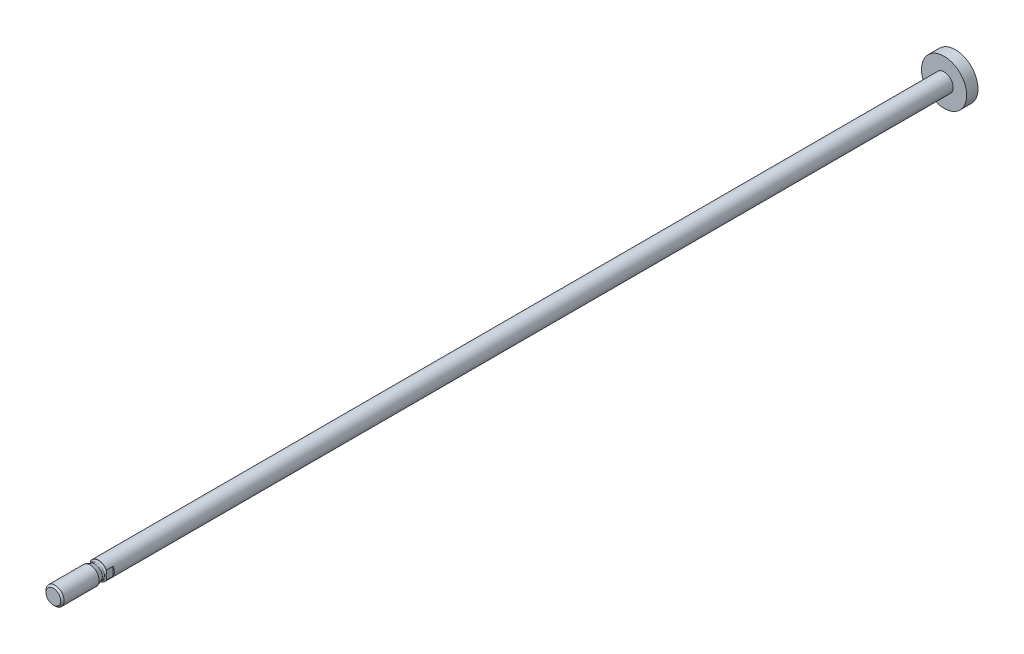
ISO-10303-21;
HEADER;
FILE_DESCRIPTION(('STEP AP214'),'2;1');
FILE_NAME('part.step','',(''),(''),'','','');
FILE_SCHEMA(('AUTOMOTIVE_DESIGN { 1 0 10303 214 1 1 1 1 }'));
ENDSEC;
DATA;
#1=APPLICATION_CONTEXT('core data for automotive mechanical design processes');
#2=APPLICATION_PROTOCOL_DEFINITION('international standard','automotive_design',2000,#1);
#3=PRODUCT_CONTEXT('',#1,'mechanical');
#4=PRODUCT('Part','Part','',(#3));
#5=PRODUCT_RELATED_PRODUCT_CATEGORY('part','',(#4));
#6=PRODUCT_DEFINITION_FORMATION('','',#4);
#7=PRODUCT_DEFINITION_CONTEXT('part definition',#1,'design');
#8=PRODUCT_DEFINITION('design','',#6,#7);
#9=PRODUCT_DEFINITION_SHAPE('','',#8);
#10=(LENGTH_UNIT() NAMED_UNIT(*) SI_UNIT(.MILLI.,.METRE.));
#11=(NAMED_UNIT(*) PLANE_ANGLE_UNIT() SI_UNIT($,.RADIAN.));
#12=(NAMED_UNIT(*) SI_UNIT($,.STERADIAN.) SOLID_ANGLE_UNIT());
#13=UNCERTAINTY_MEASURE_WITH_UNIT(LENGTH_MEASURE(1.E-05),#10,'distance_accuracy_value','');
#14=(GEOMETRIC_REPRESENTATION_CONTEXT(3) GLOBAL_UNCERTAINTY_ASSIGNED_CONTEXT((#13)) GLOBAL_UNIT_ASSIGNED_CONTEXT((#10,
#11,#12)) REPRESENTATION_CONTEXT('',''));
#15=CARTESIAN_POINT('',(0.,0.,0.));
#16=DIRECTION('',(0.,0.,1.));
#17=DIRECTION('',(1.,0.,0.));
#18=AXIS2_PLACEMENT_3D('',#15,#16,#17);
#19=CARTESIAN_POINT('',(0.,0.,4.));
#20=DIRECTION('',(0.,0.,-1.));
#21=DIRECTION('',(-1.,0.,0.));
#22=AXIS2_PLACEMENT_3D('',#19,#20,#21);
#23=PLANE('',#22);
#24=DIRECTION('',(0.,1.,0.));
#25=VECTOR('',#24,1.);
#26=CARTESIAN_POINT('',(-3.5,0.,4.));
#27=LINE('',#26,#25);
#28=CARTESIAN_POINT('',(-3.5,-1.93649167310371,4.));
#29=VERTEX_POINT('',#28);
#30=CARTESIAN_POINT('',(-3.5,-1.47986485869513,4.));
#31=VERTEX_POINT('',#30);
#32=EDGE_CURVE('E55',#29,#31,#27,.T.);
#33=ORIENTED_EDGE('',*,*,#32,.F.);
#34=CARTESIAN_POINT('',(0.,0.,4.));
#35=DIRECTION('',(0.,0.,1.));
#36=DIRECTION('',(1.,0.,0.));
#37=AXIS2_PLACEMENT_3D('',#34,#35,#36);
#38=CIRCLE('',#37,4.);
#39=CARTESIAN_POINT('',(3.5,-1.93649167310371,4.));
#40=VERTEX_POINT('',#39);
#41=EDGE_CURVE('E148',#29,#40,#38,.T.);
#42=ORIENTED_EDGE('',*,*,#41,.T.);
#43=DIRECTION('',(0.,-1.,0.));
#44=VECTOR('',#43,1.);
#45=CARTESIAN_POINT('',(3.5,0.,4.));
#46=LINE('',#45,#44);
#47=CARTESIAN_POINT('',(3.5,-1.47986485869513,3.99999999999992));
#48=VERTEX_POINT('',#47);
#49=EDGE_CURVE('E102',#48,#40,#46,.T.);
#50=ORIENTED_EDGE('',*,*,#49,.F.);
#51=CARTESIAN_POINT('',(0.,0.,4.));
#52=DIRECTION('',(0.,0.,1.));
#53=DIRECTION('',(1.,0.,0.));
#54=AXIS2_PLACEMENT_3D('',#51,#52,#53);
#55=CIRCLE('',#54,3.8000000000001);
#56=EDGE_CURVE('E150',#31,#48,#55,.T.);
#57=ORIENTED_EDGE('',*,*,#56,.F.);
#58=EDGE_LOOP('',(#33,#42,#50,#57));
#59=FACE_BOUND('',#58,.T.);
#60=ADVANCED_FACE('F41',(#59),#23,.F.);
#61=CARTESIAN_POINT('',(-3.5,1.47986485869513,3.99999999999992));
#62=VERTEX_POINT('',#61);
#63=CARTESIAN_POINT('',(-3.5,1.93649167310371,4.));
#64=VERTEX_POINT('',#63);
#65=EDGE_CURVE('E111',#62,#64,#27,.T.);
#66=ORIENTED_EDGE('',*,*,#65,.F.);
#67=CARTESIAN_POINT('',(3.5,1.47986485869513,4.));
#68=VERTEX_POINT('',#67);
#69=EDGE_CURVE('E151',#68,#62,#55,.T.);
#70=ORIENTED_EDGE('',*,*,#69,.F.);
#71=CARTESIAN_POINT('',(3.5,1.93649167310371,4.));
#72=VERTEX_POINT('',#71);
#73=EDGE_CURVE('E63',#72,#68,#46,.T.);
#74=ORIENTED_EDGE('',*,*,#73,.F.);
#75=EDGE_CURVE('E110',#72,#64,#38,.T.);
#76=ORIENTED_EDGE('',*,*,#75,.T.);
#77=EDGE_LOOP('',(#66,#70,#74,#76));
#78=FACE_BOUND('',#77,.T.);
#79=ADVANCED_FACE('F207',(#78),#23,.F.);
#80=CARTESIAN_POINT('',(0.,0.,-375.3));
#81=DIRECTION('',(0.,0.,1.));
#82=DIRECTION('',(1.,0.,0.));
#83=AXIS2_PLACEMENT_3D('',#80,#81,#82);
#84=CYLINDRICAL_SURFACE('',#83,4.);
#85=CARTESIAN_POINT('',(0.,0.,-370.3));
#86=DIRECTION('',(0.,0.,1.));
#87=DIRECTION('',(1.,0.,0.));
#88=AXIS2_PLACEMENT_3D('',#85,#86,#87);
#89=CIRCLE('',#88,4.);
#90=CARTESIAN_POINT('',(4.,0.,-370.3));
#91=VERTEX_POINT('',#90);
#92=EDGE_CURVE('E145',#91,#91,#89,.T.);
#93=ORIENTED_EDGE('',*,*,#92,.T.);
#94=EDGE_LOOP('',(#93));
#95=FACE_BOUND('',#94,.T.);
#96=DIRECTION('',(0.,0.,1.));
#97=VECTOR('',#96,1.);
#98=CARTESIAN_POINT('',(-3.5,-1.93649167310371,-375.3));
#99=LINE('',#98,#97);
#100=CARTESIAN_POINT('',(-3.5,-1.93649167310371,1.));
#101=VERTEX_POINT('',#100);
#102=EDGE_CURVE('E119',#101,#29,#99,.T.);
#103=ORIENTED_EDGE('',*,*,#102,.F.);
#104=CARTESIAN_POINT('',(0.,0.,1.));
#105=DIRECTION('',(0.,0.,1.));
#106=DIRECTION('',(1.,0.,0.));
#107=AXIS2_PLACEMENT_3D('',#104,#105,#106);
#108=CIRCLE('',#107,4.);
#109=CARTESIAN_POINT('',(-3.5,1.93649167310371,1.));
#110=VERTEX_POINT('',#109);
#111=EDGE_CURVE('E11',#110,#101,#108,.T.);
#112=ORIENTED_EDGE('',*,*,#111,.F.);
#113=DIRECTION('',(0.,0.,1.));
#114=VECTOR('',#113,1.);
#115=CARTESIAN_POINT('',(-3.5,1.93649167310371,-375.3));
#116=LINE('',#115,#114);
#117=EDGE_CURVE('E117',#64,#110,#116,.F.);
#118=ORIENTED_EDGE('',*,*,#117,.F.);
#119=ORIENTED_EDGE('',*,*,#75,.F.);
#120=DIRECTION('',(0.,0.,1.));
#121=VECTOR('',#120,1.);
#122=CARTESIAN_POINT('',(3.5,1.93649167310371,-375.3));
#123=LINE('',#122,#121);
#124=CARTESIAN_POINT('',(3.5,1.93649167310371,1.));
#125=VERTEX_POINT('',#124);
#126=EDGE_CURVE('E100',#125,#72,#123,.T.);
#127=ORIENTED_EDGE('',*,*,#126,.F.);
#128=CARTESIAN_POINT('',(3.5,-1.93649167310371,1.));
#129=VERTEX_POINT('',#128);
#130=EDGE_CURVE('E44',#129,#125,#108,.T.);
#131=ORIENTED_EDGE('',*,*,#130,.F.);
#132=DIRECTION('',(0.,0.,1.));
#133=VECTOR('',#132,1.);
#134=CARTESIAN_POINT('',(3.5,-1.93649167310371,-375.3));
#135=LINE('',#134,#133);
#136=EDGE_CURVE('E101',#40,#129,#135,.F.);
#137=ORIENTED_EDGE('',*,*,#136,.F.);
#138=ORIENTED_EDGE('',*,*,#41,.F.);
#139=EDGE_LOOP('',(#103,#112,#118,#119,#127,#131,#137,#138));
#140=FACE_BOUND('',#139,.T.);
#141=ADVANCED_FACE('F107',(#95,#140),#84,.T.);
#142=CARTESIAN_POINT('',(0.,0.,4.6000000000001));
#143=DIRECTION('',(0.,0.,1.));
#144=DIRECTION('',(1.,0.,0.));
#145=AXIS2_PLACEMENT_3D('',#142,#143,#144);
#146=TOROIDAL_SURFACE('',#145,3.8000000000001,0.600000000000099);
#147=CARTESIAN_POINT('',(0.,0.,4.6));
#148=DIRECTION('',(0.,0.,1.));
#149=DIRECTION('',(1.,0.,0.));
#150=AXIS2_PLACEMENT_3D('',#147,#148,#149);
#151=CIRCLE('',#150,3.2);
#152=CARTESIAN_POINT('',(3.2,0.,4.6));
#153=VERTEX_POINT('',#152);
#154=EDGE_CURVE('E136',#153,#153,#151,.T.);
#155=ORIENTED_EDGE('',*,*,#154,.F.);
#156=EDGE_LOOP('',(#155));
#157=FACE_BOUND('',#156,.T.);
#158=CARTESIAN_POINT('',(-3.5,0.,4.08038475772938));
#159=CARTESIAN_POINT('',(-3.5,0.0500062055653644,4.08038579524003));
#160=CARTESIAN_POINT('',(-3.5,0.10001186907905,4.07976142660828));
#161=CARTESIAN_POINT('',(-3.5,0.200008073579427,4.07732415974821));
#162=CARTESIAN_POINT('',(-3.5,0.249998606009498,4.07551091782565));
#163=CARTESIAN_POINT('',(-3.5,0.350023676666661,4.0708553451476));
#164=CARTESIAN_POINT('',(-3.5,0.400058122823757,4.06801109956585));
#165=CARTESIAN_POINT('',(-3.5,0.500067954430721,4.06154909714063));
#166=CARTESIAN_POINT('',(-3.5,0.550043347826766,4.05793146015032));
#167=CARTESIAN_POINT('',(-3.5,0.690839508563253,4.04708094798961));
#168=CARTESIAN_POINT('',(-3.5,0.781617050076563,4.03931230060361));
#169=CARTESIAN_POINT('',(-3.5,0.9632220149238,4.024401341373));
#170=CARTESIAN_POINT('',(-3.5,1.05404943604569,4.01725900370584));
#171=CARTESIAN_POINT('',(-3.5,1.2359337458161,4.00596554667804));
#172=CARTESIAN_POINT('',(-3.5,1.32699066193964,4.00181480438343));
#173=CARTESIAN_POINT('',(-3.5,1.50913050906379,3.99911696420226));
#174=CARTESIAN_POINT('',(-3.5,1.60021331380939,4.00056402453771));
#175=CARTESIAN_POINT('',(-3.5,1.7832512039485,4.01223826838346));
#176=CARTESIAN_POINT('',(-3.5,1.87520111900955,4.02258560378902));
#177=CARTESIAN_POINT('',(-3.5,2.01109807868235,4.04805353771768));
#178=CARTESIAN_POINT('',(-3.5,2.05597275422268,4.05817105079477));
#179=CARTESIAN_POINT('',(-3.5,2.1446015872334,4.08243134215497));
#180=CARTESIAN_POINT('',(-3.5,2.18835703510382,4.09656923395692));
#181=CARTESIAN_POINT('',(-3.5,2.26502423932735,4.12625619760487));
#182=CARTESIAN_POINT('',(-3.5,2.29828717281195,4.14088897580844));
#183=CARTESIAN_POINT('',(-3.5,2.36308366134456,4.17374487362841));
#184=CARTESIAN_POINT('',(-3.5,2.39461486317948,4.1919727313804));
#185=CARTESIAN_POINT('',(-3.5,2.45528633475527,4.2327718563323));
#186=CARTESIAN_POINT('',(-3.5,2.48439672100251,4.25538839857406));
#187=CARTESIAN_POINT('',(-3.5,2.53828325245288,4.30531204058377));
#188=CARTESIAN_POINT('',(-3.5,2.56307231252292,4.33260466298422));
#189=CARTESIAN_POINT('',(-3.5,2.59835539678092,4.38117119923997));
#190=CARTESIAN_POINT('',(-3.5,2.61077480767077,4.40104374871059));
#191=CARTESIAN_POINT('',(-3.5,2.63229473049418,4.44252572441527));
#192=CARTESIAN_POINT('',(-3.5,2.64139766596252,4.4641338682032));
#193=CARTESIAN_POINT('',(-3.5,2.6556780834849,4.50882581532605));
#194=CARTESIAN_POINT('',(-3.5,2.66082330977963,4.53192011572204));
#195=CARTESIAN_POINT('',(-3.5,2.66658722454624,4.57866774033149));
#196=CARTESIAN_POINT('',(-3.5,2.66720861100635,4.60232072290385));
#197=CARTESIAN_POINT('',(-3.5,2.66406334493496,4.64664399355305));
#198=CARTESIAN_POINT('',(-3.5,2.66078189261244,4.66735080097796));
#199=CARTESIAN_POINT('',(-3.5,2.65086769882215,4.70793958933708));
#200=CARTESIAN_POINT('',(-3.5,2.64423425840105,4.72782139730718));
#201=CARTESIAN_POINT('',(-3.5,2.62783818542989,4.76683694228269));
#202=CARTESIAN_POINT('',(-3.5,2.61799948146632,4.78593830149638));
#203=CARTESIAN_POINT('',(-3.5,2.5957864239932,4.8225893297694));
#204=CARTESIAN_POINT('',(-3.5,2.58341098566742,4.84013833036213));
#205=CARTESIAN_POINT('',(-3.5,2.54827666077279,4.88403391197271));
#206=CARTESIAN_POINT('',(-3.5,2.52385245228452,4.90904933157706));
#207=CARTESIAN_POINT('',(-3.5,2.4713802477796,4.95494570673838));
#208=CARTESIAN_POINT('',(-3.5,2.44332184293567,4.97581433256553));
#209=CARTESIAN_POINT('',(-3.5,2.36690919769617,5.02546583684508));
#210=CARTESIAN_POINT('',(-3.5,2.31664003371327,5.05127975894021));
#211=CARTESIAN_POINT('',(-3.5,2.21292774859494,5.09519868885441));
#212=CARTESIAN_POINT('',(-3.5,2.15947928807564,5.11329028588226));
#213=CARTESIAN_POINT('',(-3.5,2.05241854459677,5.14298422713627));
#214=CARTESIAN_POINT('',(-3.5,1.99885008338122,5.15474937556394));
#215=CARTESIAN_POINT('',(-3.5,1.89088555933464,5.17371645891197));
#216=CARTESIAN_POINT('',(-3.5,1.83648865462849,5.18091338377391));
#217=CARTESIAN_POINT('',(-3.5,1.72719420827212,5.19169636188153));
#218=CARTESIAN_POINT('',(-3.5,1.67229565989963,5.19527163434467));
#219=CARTESIAN_POINT('',(-3.5,1.56237784754192,5.19956192851468));
#220=CARTESIAN_POINT('',(-3.5,1.50735854591716,5.20027587383621));
#221=CARTESIAN_POINT('',(-3.5,1.32143089044828,5.19902509431349));
#222=CARTESIAN_POINT('',(-3.5,1.19058803810505,5.1920033327333));
#223=CARTESIAN_POINT('',(-3.5,0.929144323978893,5.17339442832176));
#224=CARTESIAN_POINT('',(-3.5,0.798544182549121,5.161800011167));
#225=CARTESIAN_POINT('',(-3.5,0.602747235241971,5.14602809613734));
#226=CARTESIAN_POINT('',(-3.5,0.537627510492783,5.14104900273235));
#227=CARTESIAN_POINT('',(-3.5,0.407306821786678,5.1323371224062));
#228=CARTESIAN_POINT('',(-3.5,0.342105863988336,5.1286042461649));
#229=CARTESIAN_POINT('',(-3.5,0.211728862091437,5.1229526202353));
#230=CARTESIAN_POINT('',(-3.5,0.146552955128154,5.1210308804655));
#231=CARTESIAN_POINT('',(-3.5,0.0161730194372509,5.11928917221939));
#232=CARTESIAN_POINT('',(-3.5,-0.0490310086083378,5.11946915535245));
#233=CARTESIAN_POINT('',(-3.5,-0.179475576502579,5.12190517622444));
#234=CARTESIAN_POINT('',(-3.5,-0.244716066981349,5.12416369265122));
#235=CARTESIAN_POINT('',(-3.5,-0.375115910587606,5.13040554579892));
#236=CARTESIAN_POINT('',(-3.5,-0.440275258610719,5.13438898602551));
#237=CARTESIAN_POINT('',(-3.5,-0.635895337566246,5.14807827632179));
#238=CARTESIAN_POINT('',(-3.5,-0.76621884732944,5.15951342405818));
#239=CARTESIAN_POINT('',(-3.5,-1.02713131334285,5.18073972163101));
#240=CARTESIAN_POINT('',(-3.5,-1.15772038871775,5.19052976890211));
#241=CARTESIAN_POINT('',(-3.5,-1.35378409785631,5.19852164600105));
#242=CARTESIAN_POINT('',(-3.5,-1.41909161309346,5.2000721709194));
#243=CARTESIAN_POINT('',(-3.5,-1.54969188303483,5.19992263560432));
#244=CARTESIAN_POINT('',(-3.5,-1.61498463760302,5.19822333879744));
#245=CARTESIAN_POINT('',(-3.5,-1.76029290673312,5.18951322581212));
#246=CARTESIAN_POINT('',(-3.5,-1.84025983788535,5.18137635704226));
#247=CARTESIAN_POINT('',(-3.5,-1.95903476517147,5.16210189637695));
#248=CARTESIAN_POINT('',(-3.5,-1.99841540324246,5.15450321251105));
#249=CARTESIAN_POINT('',(-3.5,-2.07652038986955,5.13650653853808));
#250=CARTESIAN_POINT('',(-3.5,-2.11524511477409,5.12611021577707));
#251=CARTESIAN_POINT('',(-3.5,-2.19864889359521,5.0998048910277));
#252=CARTESIAN_POINT('',(-3.5,-2.24312539757502,5.08323620538603));
#253=CARTESIAN_POINT('',(-3.5,-2.32958676042036,5.04443385186534));
#254=CARTESIAN_POINT('',(-3.5,-2.37157403081922,5.022205781053));
#255=CARTESIAN_POINT('',(-3.5,-2.43977528813279,4.97826900973618));
#256=CARTESIAN_POINT('',(-3.5,-2.46706045695041,4.95823818276675));
#257=CARTESIAN_POINT('',(-3.5,-2.51831793755153,4.91428859212922));
#258=CARTESIAN_POINT('',(-3.5,-2.54229604965639,4.89037680000235));
#259=CARTESIAN_POINT('',(-3.5,-2.57970363739195,4.84535217347594));
#260=CARTESIAN_POINT('',(-3.5,-2.59424612037896,4.82517000607983));
#261=CARTESIAN_POINT('',(-3.5,-2.61992505476884,4.78272143024207));
#262=CARTESIAN_POINT('',(-3.5,-2.63106349643882,4.76045624967719));
#263=CARTESIAN_POINT('',(-3.5,-2.64920025698533,4.7140036601898));
#264=CARTESIAN_POINT('',(-3.5,-2.65615513895816,4.68979894460471));
#265=CARTESIAN_POINT('',(-3.5,-2.66504809529779,4.64048613942947));
#266=CARTESIAN_POINT('',(-3.5,-2.66699167521719,4.61537907197386));
#267=CARTESIAN_POINT('',(-3.5,-2.66576972792539,4.56913838413921));
#268=CARTESIAN_POINT('',(-3.5,-2.66333713024049,4.54798188760978));
#269=CARTESIAN_POINT('',(-3.5,-2.65493122425014,4.50638930411087));
#270=CARTESIAN_POINT('',(-3.5,-2.6489573784939,4.4859533269926));
#271=CARTESIAN_POINT('',(-3.5,-2.63391040496586,4.44635032544822));
#272=CARTESIAN_POINT('',(-3.5,-2.62484735225162,4.42717941476791));
#273=CARTESIAN_POINT('',(-3.5,-2.60412982714912,4.39030840624931));
#274=CARTESIAN_POINT('',(-3.5,-2.59247439145874,4.37260885852133));
#275=CARTESIAN_POINT('',(-3.5,-2.55964651342061,4.32891810073296));
#276=CARTESIAN_POINT('',(-3.5,-2.53688962871665,4.30411605633953));
#277=CARTESIAN_POINT('',(-3.5,-2.48775025498198,4.25840323881892));
#278=CARTESIAN_POINT('',(-3.5,-2.46135776993871,4.2375035818933));
#279=CARTESIAN_POINT('',(-3.5,-2.38986954756856,4.18798307162582));
#280=CARTESIAN_POINT('',(-3.5,-2.34291429622141,4.16206577415089));
#281=CARTESIAN_POINT('',(-3.5,-2.24574558542675,4.11749887118979));
#282=CARTESIAN_POINT('',(-3.5,-2.19552624943271,4.09886282247383));
#283=CARTESIAN_POINT('',(-3.5,-2.09587462128469,4.06817578766957));
#284=CARTESIAN_POINT('',(-3.5,-2.04652620992952,4.05584474254379));
#285=CARTESIAN_POINT('',(-3.5,-1.94693895896851,4.0354159388682));
#286=CARTESIAN_POINT('',(-3.5,-1.89669924688715,4.02732259522156));
#287=CARTESIAN_POINT('',(-3.5,-1.74513146101115,4.00812320842939));
#288=CARTESIAN_POINT('',(-3.5,-1.64316995649346,4.00215511449531));
#289=CARTESIAN_POINT('',(-3.5,-1.41246700498561,3.99839333626015));
#290=CARTESIAN_POINT('',(-3.5,-1.28373629994329,4.00316287285656));
#291=CARTESIAN_POINT('',(-3.5,-1.02661753839385,4.01880990476259));
#292=CARTESIAN_POINT('',(-3.5,-0.898230000845064,4.0296939787844));
#293=CARTESIAN_POINT('',(-3.5,-0.705746127745405,4.04568170858882));
#294=CARTESIAN_POINT('',(-3.5,-0.641662853121003,4.05094963535158));
#295=CARTESIAN_POINT('',(-3.5,-0.513433811524688,4.06064102594273));
#296=CARTESIAN_POINT('',(-3.5,-0.449288049445188,4.06506455125933));
#297=CARTESIAN_POINT('',(-3.5,-0.32098353941607,4.07243012154035));
#298=CARTESIAN_POINT('',(-3.5,-0.256824896504214,4.07537391204972));
#299=CARTESIAN_POINT('',(-3.5,-0.128443871708583,4.07935057895739));
#300=CARTESIAN_POINT('',(-3.5,-0.0642214888377097,4.08038342528518));
#301=CARTESIAN_POINT('',(-3.5,0.,4.08038475772938));
#302=B_SPLINE_CURVE_WITH_KNOTS('',3,(#158,#159,#160,#161,#162,#163,#164,#165,#166,#167,#168,
#169,#170,#171,#172,#173,#174,#175,#176,#177,#178,#179,#180,#181,#182,#183,#184,#185,#186,#187,
#188,#189,#190,#191,#192,#193,#194,#195,#196,#197,#198,#199,#200,#201,#202,#203,#204,#205,#206,
#207,#208,#209,#210,#211,#212,#213,#214,#215,#216,#217,#218,#219,#220,#221,#222,#223,#224,#225,
#226,#227,#228,#229,#230,#231,#232,#233,#234,#235,#236,#237,#238,#239,#240,#241,#242,#243,#244,
#245,#246,#247,#248,#249,#250,#251,#252,#253,#254,#255,#256,#257,#258,#259,#260,#261,#262,#263,
#264,#265,#266,#267,#268,#269,#270,#271,#272,#273,#274,#275,#276,#277,#278,#279,#280,#281,#282,
#283,#284,#285,#286,#287,#288,#289,#290,#291,#292,#293,#294,#295,#296,#297,#298,#299,#300,#301),
.UNSPECIFIED.,.T.,.F.,(4,2,2,2,2,2,2,2,2,2,2,2,2,2,2,2,2,2,2,2,2,2,2,2,2,2,2,2,2,2,2,2,2,2,2,2,
2,2,2,2,2,2,2,2,2,2,2,2,2,2,2,2,2,2,2,2,2,2,2,2,2,2,2,2,2,2,2,2,2,2,2,4),(0.,0.150014048798422,
0.300071484653546,0.450409053935331,0.600723342136289,0.874049825720873,1.14736503484109,
1.42071468707779,1.69377915294987,1.97058884479861,2.10845216776641,2.2461486387614,
2.35499514952082,2.46398608488314,2.57416771557531,2.68401418736232,2.75406745328572,
2.8240694241867,2.89463604494047,2.96516057677686,3.02776088906933,3.09037426010844,
3.15459752456243,3.21884831114799,3.32313116232507,3.42771958650061,3.59629393435684,
3.76515985338398,3.92944239010749,4.09390478874738,4.25885532608726,4.42386790935157,
4.81662747336841,5.21001438834882,5.4059342565683,5.60184007960282,5.79742190395237,
5.99299922518425,6.18881007848093,6.38463268321895,6.77711538137523,7.16986008579766,
7.36577121673005,7.56163633117303,7.80230390131153,7.92254416345271,8.04271292251144,
8.18480424522089,8.32675558344215,8.42801297124486,8.5290904393555,8.60345225460728,
8.67777050861516,8.75284763934138,8.82784225307812,8.89141694017011,8.95500127838402,
9.01838019760285,9.08178270722154,9.1821864562108,9.28287198824411,9.44286612854139,
9.60315675421254,9.75552106026109,9.90804378754775,10.2137509318015,10.5998737561413,
10.9864128129893,11.1793105025674,11.372194140224,11.5648497087301,11.7575083088275),.UNSPECIFIED.);
#303=EDGE_CURVE('E98',#31,#62,#302,.T.);
#304=ORIENTED_EDGE('',*,*,#303,.F.);
#305=ORIENTED_EDGE('',*,*,#56,.T.);
#306=CARTESIAN_POINT('',(3.5,0.,4.08038475772938));
#307=CARTESIAN_POINT('',(3.5,-0.0500062055653644,4.08038579524003));
#308=CARTESIAN_POINT('',(3.5,-0.10001186907905,4.07976142660828));
#309=CARTESIAN_POINT('',(3.5,-0.200008073579427,4.07732415974821));
#310=CARTESIAN_POINT('',(3.5,-0.249998606009498,4.07551091782565));
#311=CARTESIAN_POINT('',(3.5,-0.350023676666661,4.0708553451476));
#312=CARTESIAN_POINT('',(3.5,-0.400058122823757,4.06801109956585));
#313=CARTESIAN_POINT('',(3.5,-0.500067954430721,4.06154909714063));
#314=CARTESIAN_POINT('',(3.5,-0.550043347826766,4.05793146015032));
#315=CARTESIAN_POINT('',(3.5,-0.690839508563253,4.04708094798961));
#316=CARTESIAN_POINT('',(3.5,-0.781617050076563,4.03931230060361));
#317=CARTESIAN_POINT('',(3.5,-0.9632220149238,4.024401341373));
#318=CARTESIAN_POINT('',(3.5,-1.05404943604569,4.01725900370584));
#319=CARTESIAN_POINT('',(3.5,-1.2359337458161,4.00596554667804));
#320=CARTESIAN_POINT('',(3.5,-1.32699066193964,4.00181480438343));
#321=CARTESIAN_POINT('',(3.5,-1.50913050906379,3.99911696420226));
#322=CARTESIAN_POINT('',(3.5,-1.60021331380939,4.00056402453771));
#323=CARTESIAN_POINT('',(3.5,-1.7832512039485,4.01223826838346));
#324=CARTESIAN_POINT('',(3.5,-1.87520111900955,4.02258560378902));
#325=CARTESIAN_POINT('',(3.5,-2.01109807868235,4.04805353771768));
#326=CARTESIAN_POINT('',(3.5,-2.05597275422268,4.05817105079477));
#327=CARTESIAN_POINT('',(3.5,-2.1446015872334,4.08243134215497));
#328=CARTESIAN_POINT('',(3.5,-2.18835703510382,4.09656923395692));
#329=CARTESIAN_POINT('',(3.5,-2.26502423932735,4.12625619760487));
#330=CARTESIAN_POINT('',(3.5,-2.29828717281195,4.14088897580844));
#331=CARTESIAN_POINT('',(3.5,-2.36308366134456,4.17374487362841));
#332=CARTESIAN_POINT('',(3.5,-2.39461486317948,4.1919727313804));
#333=CARTESIAN_POINT('',(3.5,-2.45528633475527,4.2327718563323));
#334=CARTESIAN_POINT('',(3.5,-2.48439672100251,4.25538839857406));
#335=CARTESIAN_POINT('',(3.5,-2.53828325245288,4.30531204058377));
#336=CARTESIAN_POINT('',(3.5,-2.56307231252292,4.33260466298422));
#337=CARTESIAN_POINT('',(3.5,-2.59835539678092,4.38117119923997));
#338=CARTESIAN_POINT('',(3.5,-2.61077480767077,4.40104374871059));
#339=CARTESIAN_POINT('',(3.5,-2.63229473049418,4.44252572441527));
#340=CARTESIAN_POINT('',(3.5,-2.64139766596252,4.4641338682032));
#341=CARTESIAN_POINT('',(3.5,-2.6556780834849,4.50882581532605));
#342=CARTESIAN_POINT('',(3.5,-2.66082330977963,4.53192011572204));
#343=CARTESIAN_POINT('',(3.5,-2.66658722454624,4.57866774033149));
#344=CARTESIAN_POINT('',(3.5,-2.66720861100635,4.60232072290385));
#345=CARTESIAN_POINT('',(3.5,-2.66406334493496,4.64664399355305));
#346=CARTESIAN_POINT('',(3.5,-2.66078189261244,4.66735080097796));
#347=CARTESIAN_POINT('',(3.5,-2.65086769882215,4.70793958933708));
#348=CARTESIAN_POINT('',(3.5,-2.64423425840105,4.72782139730718));
#349=CARTESIAN_POINT('',(3.5,-2.62783818542989,4.76683694228269));
#350=CARTESIAN_POINT('',(3.5,-2.61799948146632,4.78593830149638));
#351=CARTESIAN_POINT('',(3.5,-2.5957864239932,4.8225893297694));
#352=CARTESIAN_POINT('',(3.5,-2.58341098566742,4.84013833036213));
#353=CARTESIAN_POINT('',(3.5,-2.54827666077279,4.88403391197271));
#354=CARTESIAN_POINT('',(3.5,-2.52385245228452,4.90904933157706));
#355=CARTESIAN_POINT('',(3.5,-2.4713802477796,4.95494570673838));
#356=CARTESIAN_POINT('',(3.5,-2.44332184293567,4.97581433256553));
#357=CARTESIAN_POINT('',(3.5,-2.36690919769617,5.02546583684508));
#358=CARTESIAN_POINT('',(3.5,-2.31664003371327,5.05127975894021));
#359=CARTESIAN_POINT('',(3.5,-2.21292774859494,5.09519868885441));
#360=CARTESIAN_POINT('',(3.5,-2.15947928807564,5.11329028588226));
#361=CARTESIAN_POINT('',(3.5,-2.05241854459677,5.14298422713627));
#362=CARTESIAN_POINT('',(3.5,-1.99885008338122,5.15474937556394));
#363=CARTESIAN_POINT('',(3.5,-1.89088555933464,5.17371645891197));
#364=CARTESIAN_POINT('',(3.5,-1.83648865462849,5.18091338377391));
#365=CARTESIAN_POINT('',(3.5,-1.72719420827212,5.19169636188153));
#366=CARTESIAN_POINT('',(3.5,-1.67229565989963,5.19527163434467));
#367=CARTESIAN_POINT('',(3.5,-1.56237784754192,5.19956192851468));
#368=CARTESIAN_POINT('',(3.5,-1.50735854591716,5.20027587383621));
#369=CARTESIAN_POINT('',(3.5,-1.32143089044828,5.19902509431349));
#370=CARTESIAN_POINT('',(3.5,-1.19058803810505,5.1920033327333));
#371=CARTESIAN_POINT('',(3.5,-0.929144323978893,5.17339442832176));
#372=CARTESIAN_POINT('',(3.5,-0.798544182549121,5.161800011167));
#373=CARTESIAN_POINT('',(3.5,-0.602747235241971,5.14602809613734));
#374=CARTESIAN_POINT('',(3.5,-0.537627510492783,5.14104900273235));
#375=CARTESIAN_POINT('',(3.5,-0.407306821786678,5.1323371224062));
#376=CARTESIAN_POINT('',(3.5,-0.342105863988336,5.1286042461649));
#377=CARTESIAN_POINT('',(3.5,-0.211728862091437,5.1229526202353));
#378=CARTESIAN_POINT('',(3.5,-0.146552955128154,5.1210308804655));
#379=CARTESIAN_POINT('',(3.5,-0.0161730194372509,5.11928917221939));
#380=CARTESIAN_POINT('',(3.5,0.0490310086083378,5.11946915535245));
#381=CARTESIAN_POINT('',(3.5,0.179475576502579,5.12190517622444));
#382=CARTESIAN_POINT('',(3.5,0.244716066981349,5.12416369265122));
#383=CARTESIAN_POINT('',(3.5,0.375115910587606,5.13040554579892));
#384=CARTESIAN_POINT('',(3.5,0.440275258610719,5.13438898602551));
#385=CARTESIAN_POINT('',(3.5,0.635895337566246,5.14807827632179));
#386=CARTESIAN_POINT('',(3.5,0.76621884732944,5.15951342405818));
#387=CARTESIAN_POINT('',(3.5,1.02713131334285,5.18073972163101));
#388=CARTESIAN_POINT('',(3.5,1.15772038871775,5.19052976890211));
#389=CARTESIAN_POINT('',(3.5,1.35378409785631,5.19852164600105));
#390=CARTESIAN_POINT('',(3.5,1.41909161309346,5.2000721709194));
#391=CARTESIAN_POINT('',(3.5,1.54969188303483,5.19992263560432));
#392=CARTESIAN_POINT('',(3.5,1.61498463760302,5.19822333879744));
#393=CARTESIAN_POINT('',(3.5,1.76029290673312,5.18951322581212));
#394=CARTESIAN_POINT('',(3.5,1.84025983788535,5.18137635704226));
#395=CARTESIAN_POINT('',(3.5,1.95903476517147,5.16210189637695));
#396=CARTESIAN_POINT('',(3.5,1.99841540324246,5.15450321251105));
#397=CARTESIAN_POINT('',(3.5,2.07652038986955,5.13650653853808));
#398=CARTESIAN_POINT('',(3.5,2.11524511477409,5.12611021577707));
#399=CARTESIAN_POINT('',(3.5,2.19864889359521,5.0998048910277));
#400=CARTESIAN_POINT('',(3.5,2.24312539757502,5.08323620538603));
#401=CARTESIAN_POINT('',(3.5,2.32958676042036,5.04443385186534));
#402=CARTESIAN_POINT('',(3.5,2.37157403081922,5.022205781053));
#403=CARTESIAN_POINT('',(3.5,2.43977528813279,4.97826900973618));
#404=CARTESIAN_POINT('',(3.5,2.46706045695041,4.95823818276675));
#405=CARTESIAN_POINT('',(3.5,2.51831793755153,4.91428859212922));
#406=CARTESIAN_POINT('',(3.5,2.54229604965639,4.89037680000235));
#407=CARTESIAN_POINT('',(3.5,2.57970363739195,4.84535217347594));
#408=CARTESIAN_POINT('',(3.5,2.59424612037896,4.82517000607983));
#409=CARTESIAN_POINT('',(3.5,2.61992505476884,4.78272143024207));
#410=CARTESIAN_POINT('',(3.5,2.63106349643882,4.76045624967719));
#411=CARTESIAN_POINT('',(3.5,2.64920025698533,4.7140036601898));
#412=CARTESIAN_POINT('',(3.5,2.65615513895816,4.68979894460471));
#413=CARTESIAN_POINT('',(3.5,2.66504809529779,4.64048613942947));
#414=CARTESIAN_POINT('',(3.5,2.66699167521719,4.61537907197386));
#415=CARTESIAN_POINT('',(3.5,2.66576972792539,4.56913838413921));
#416=CARTESIAN_POINT('',(3.5,2.66333713024049,4.54798188760978));
#417=CARTESIAN_POINT('',(3.5,2.65493122425014,4.50638930411087));
#418=CARTESIAN_POINT('',(3.5,2.6489573784939,4.4859533269926));
#419=CARTESIAN_POINT('',(3.5,2.63391040496586,4.44635032544822));
#420=CARTESIAN_POINT('',(3.5,2.62484735225162,4.42717941476791));
#421=CARTESIAN_POINT('',(3.5,2.60412982714912,4.39030840624931));
#422=CARTESIAN_POINT('',(3.5,2.59247439145874,4.37260885852133));
#423=CARTESIAN_POINT('',(3.5,2.55964651342061,4.32891810073296));
#424=CARTESIAN_POINT('',(3.5,2.53688962871665,4.30411605633953));
#425=CARTESIAN_POINT('',(3.5,2.48775025498198,4.25840323881892));
#426=CARTESIAN_POINT('',(3.5,2.46135776993871,4.2375035818933));
#427=CARTESIAN_POINT('',(3.5,2.38986954756856,4.18798307162582));
#428=CARTESIAN_POINT('',(3.5,2.34291429622141,4.16206577415089));
#429=CARTESIAN_POINT('',(3.5,2.24574558542675,4.11749887118979));
#430=CARTESIAN_POINT('',(3.5,2.19552624943271,4.09886282247383));
#431=CARTESIAN_POINT('',(3.5,2.09587462128469,4.06817578766957));
#432=CARTESIAN_POINT('',(3.5,2.04652620992952,4.05584474254379));
#433=CARTESIAN_POINT('',(3.5,1.94693895896851,4.0354159388682));
#434=CARTESIAN_POINT('',(3.5,1.89669924688715,4.02732259522156));
#435=CARTESIAN_POINT('',(3.5,1.74513146101115,4.00812320842939));
#436=CARTESIAN_POINT('',(3.5,1.64316995649346,4.00215511449531));
#437=CARTESIAN_POINT('',(3.5,1.41246700498561,3.99839333626015));
#438=CARTESIAN_POINT('',(3.5,1.28373629994329,4.00316287285656));
#439=CARTESIAN_POINT('',(3.5,1.02661753839385,4.01880990476259));
#440=CARTESIAN_POINT('',(3.5,0.898230000845064,4.0296939787844));
#441=CARTESIAN_POINT('',(3.5,0.705746127745405,4.04568170858882));
#442=CARTESIAN_POINT('',(3.5,0.641662853121003,4.05094963535158));
#443=CARTESIAN_POINT('',(3.5,0.513433811524688,4.06064102594273));
#444=CARTESIAN_POINT('',(3.5,0.449288049445188,4.06506455125933));
#445=CARTESIAN_POINT('',(3.5,0.32098353941607,4.07243012154035));
#446=CARTESIAN_POINT('',(3.5,0.256824896504214,4.07537391204972));
#447=CARTESIAN_POINT('',(3.5,0.128443871708583,4.07935057895739));
#448=CARTESIAN_POINT('',(3.5,0.0642214888377097,4.08038342528518));
#449=CARTESIAN_POINT('',(3.5,0.,4.08038475772938));
#450=B_SPLINE_CURVE_WITH_KNOTS('',3,(#306,#307,#308,#309,#310,#311,#312,#313,#314,#315,#316,
#317,#318,#319,#320,#321,#322,#323,#324,#325,#326,#327,#328,#329,#330,#331,#332,#333,#334,#335,
#336,#337,#338,#339,#340,#341,#342,#343,#344,#345,#346,#347,#348,#349,#350,#351,#352,#353,#354,
#355,#356,#357,#358,#359,#360,#361,#362,#363,#364,#365,#366,#367,#368,#369,#370,#371,#372,#373,
#374,#375,#376,#377,#378,#379,#380,#381,#382,#383,#384,#385,#386,#387,#388,#389,#390,#391,#392,
#393,#394,#395,#396,#397,#398,#399,#400,#401,#402,#403,#404,#405,#406,#407,#408,#409,#410,#411,
#412,#413,#414,#415,#416,#417,#418,#419,#420,#421,#422,#423,#424,#425,#426,#427,#428,#429,#430,
#431,#432,#433,#434,#435,#436,#437,#438,#439,#440,#441,#442,#443,#444,#445,#446,#447,#448,#449),
.UNSPECIFIED.,.T.,.F.,(4,2,2,2,2,2,2,2,2,2,2,2,2,2,2,2,2,2,2,2,2,2,2,2,2,2,2,2,2,2,2,2,2,2,2,2,
2,2,2,2,2,2,2,2,2,2,2,2,2,2,2,2,2,2,2,2,2,2,2,2,2,2,2,2,2,2,2,2,2,2,2,4),(0.,0.150014048798422,
0.300071484653546,0.450409053935331,0.600723342136289,0.874049825720873,1.14736503484109,
1.42071468707779,1.69377915294987,1.97058884479861,2.10845216776641,2.2461486387614,
2.35499514952082,2.46398608488314,2.57416771557531,2.68401418736232,2.75406745328572,
2.8240694241867,2.89463604494047,2.96516057677686,3.02776088906933,3.09037426010844,
3.15459752456243,3.21884831114799,3.32313116232507,3.42771958650061,3.59629393435684,
3.76515985338398,3.92944239010749,4.09390478874738,4.25885532608726,4.42386790935157,
4.81662747336841,5.21001438834882,5.4059342565683,5.60184007960282,5.79742190395237,
5.99299922518425,6.18881007848093,6.38463268321895,6.77711538137523,7.16986008579766,
7.36577121673005,7.56163633117303,7.80230390131153,7.92254416345271,8.04271292251144,
8.18480424522089,8.32675558344215,8.42801297124486,8.5290904393555,8.60345225460728,
8.67777050861516,8.75284763934138,8.82784225307812,8.89141694017011,8.95500127838402,
9.01838019760285,9.08178270722154,9.1821864562108,9.28287198824411,9.44286612854139,
9.60315675421254,9.75552106026109,9.90804378754775,10.2137509318015,10.5998737561413,
10.9864128129893,11.1793105025674,11.372194140224,11.5648497087301,11.7575083088275),.UNSPECIFIED.);
#451=EDGE_CURVE('E154',#68,#48,#450,.T.);
#452=ORIENTED_EDGE('',*,*,#451,.F.);
#453=ORIENTED_EDGE('',*,*,#69,.T.);
#454=EDGE_LOOP('',(#304,#305,#452,#453));
#455=FACE_BOUND('',#454,.T.);
#456=ADVANCED_FACE('F164',(#157,#455),#146,.F.);
#457=CARTESIAN_POINT('',(0.,4.,-370.3));
#458=DIRECTION('',(0.,0.,-1.));
#459=DIRECTION('',(-1.,0.,0.));
#460=AXIS2_PLACEMENT_3D('',#457,#458,#459);
#461=PLANE('',#460);
#462=ORIENTED_EDGE('',*,*,#92,.F.);
#463=EDGE_LOOP('',(#462));
#464=FACE_BOUND('',#463,.T.);
#465=CARTESIAN_POINT('',(0.,0.,-370.3));
#466=DIRECTION('',(0.,0.,1.));
#467=DIRECTION('',(1.,0.,0.));
#468=AXIS2_PLACEMENT_3D('',#465,#466,#467);
#469=CIRCLE('',#468,10.);
#470=CARTESIAN_POINT('',(10.,0.,-370.3));
#471=VERTEX_POINT('',#470);
#472=EDGE_CURVE('E142',#471,#471,#469,.T.);
#473=ORIENTED_EDGE('',*,*,#472,.T.);
#474=EDGE_LOOP('',(#473));
#475=FACE_BOUND('',#474,.T.);
#476=ADVANCED_FACE('F227',(#464,#475),#461,.F.);
#477=CARTESIAN_POINT('',(0.,0.,-375.3));
#478=DIRECTION('',(0.,0.,1.));
#479=DIRECTION('',(1.,0.,0.));
#480=AXIS2_PLACEMENT_3D('',#477,#478,#479);
#481=CYLINDRICAL_SURFACE('',#480,10.);
#482=ORIENTED_EDGE('',*,*,#472,.F.);
#483=EDGE_LOOP('',(#482));
#484=FACE_BOUND('',#483,.T.);
#485=CARTESIAN_POINT('',(0.,0.,-375.3));
#486=DIRECTION('',(0.,0.,1.));
#487=DIRECTION('',(1.,0.,0.));
#488=AXIS2_PLACEMENT_3D('',#485,#486,#487);
#489=CIRCLE('',#488,10.);
#490=CARTESIAN_POINT('',(10.,0.,-375.3));
#491=VERTEX_POINT('',#490);
#492=EDGE_CURVE('E139',#491,#491,#489,.T.);
#493=ORIENTED_EDGE('',*,*,#492,.T.);
#494=EDGE_LOOP('',(#493));
#495=FACE_BOUND('',#494,.T.);
#496=ADVANCED_FACE('F202',(#484,#495),#481,.T.);
#497=CARTESIAN_POINT('',(0.,10.,-375.3));
#498=DIRECTION('',(0.,0.,1.));
#499=DIRECTION('',(1.,0.,0.));
#500=AXIS2_PLACEMENT_3D('',#497,#498,#499);
#501=PLANE('',#500);
#502=ORIENTED_EDGE('',*,*,#492,.F.);
#503=EDGE_LOOP('',(#502));
#504=FACE_BOUND('',#503,.T.);
#505=ADVANCED_FACE('F197',(#504),#501,.F.);
#506=CARTESIAN_POINT('',(0.,0.,3.));
#507=DIRECTION('',(0.,0.,1.));
#508=DIRECTION('',(1.,0.,0.));
#509=AXIS2_PLACEMENT_3D('',#506,#507,#508);
#510=CYLINDRICAL_SURFACE('',#509,3.2);
#511=CARTESIAN_POINT('',(0.,0.,5.3942038115749));
#512=DIRECTION('',(0.,0.,1.));
#513=DIRECTION('',(1.,0.,0.));
#514=AXIS2_PLACEMENT_3D('',#511,#512,#513);
#515=CIRCLE('',#514,3.2);
#516=CARTESIAN_POINT('',(3.2,0.,5.3942038115749));
#517=VERTEX_POINT('',#516);
#518=EDGE_CURVE('E133',#517,#517,#515,.T.);
#519=ORIENTED_EDGE('',*,*,#518,.F.);
#520=EDGE_LOOP('',(#519));
#521=FACE_BOUND('',#520,.T.);
#522=ORIENTED_EDGE('',*,*,#154,.T.);
#523=EDGE_LOOP('',(#522));
#524=FACE_BOUND('',#523,.T.);
#525=ADVANCED_FACE('F194',(#521,#524),#510,.T.);
#526=CARTESIAN_POINT('',(0.,0.,5.39420381157482));
#527=DIRECTION('',(0.,0.,1.));
#528=DIRECTION('',(1.,0.,0.));
#529=AXIS2_PLACEMENT_3D('',#526,#527,#528);
#530=TOROIDAL_SURFACE('',#529,3.79999999999973,0.599999999999732);
#531=CARTESIAN_POINT('',(0.,0.,5.5994158975703));
#532=DIRECTION('',(0.,0.,1.));
#533=DIRECTION('',(1.,0.,0.));
#534=AXIS2_PLACEMENT_3D('',#531,#532,#533);
#535=CIRCLE('',#534,3.2361844275285);
#536=CARTESIAN_POINT('',(3.2361844275285,0.,5.5994158975703));
#537=VERTEX_POINT('',#536);
#538=EDGE_CURVE('E130',#537,#537,#535,.T.);
#539=ORIENTED_EDGE('',*,*,#538,.F.);
#540=EDGE_LOOP('',(#539));
#541=FACE_BOUND('',#540,.T.);
#542=ORIENTED_EDGE('',*,*,#518,.T.);
#543=EDGE_LOOP('',(#542));
#544=FACE_BOUND('',#543,.T.);
#545=ADVANCED_FACE('F191',(#541,#544),#530,.F.);
#546=CARTESIAN_POINT('',(0.,0.,5.5994158975703));
#547=DIRECTION('',(0.,0.,1.));
#548=DIRECTION('',(1.,0.,0.));
#549=AXIS2_PLACEMENT_3D('',#546,#547,#548);
#550=CONICAL_SURFACE('',#549,3.2361844275285,0.349065850398843);
#551=CARTESIAN_POINT('',(0.,0.,7.6979819355637));
#552=DIRECTION('',(0.,0.,1.));
#553=DIRECTION('',(1.,0.,0.));
#554=AXIS2_PLACEMENT_3D('',#551,#552,#553);
#555=CIRCLE('',#554,4.);
#556=CARTESIAN_POINT('',(4.,0.,7.6979819355637));
#557=VERTEX_POINT('',#556);
#558=EDGE_CURVE('E127',#557,#557,#555,.T.);
#559=ORIENTED_EDGE('',*,*,#558,.F.);
#560=EDGE_LOOP('',(#559));
#561=FACE_BOUND('',#560,.T.);
#562=ORIENTED_EDGE('',*,*,#538,.T.);
#563=EDGE_LOOP('',(#562));
#564=FACE_BOUND('',#563,.T.);
#565=ADVANCED_FACE('F187',(#561,#564),#550,.T.);
#566=CARTESIAN_POINT('',(0.,0.,3.));
#567=DIRECTION('',(0.,0.,1.));
#568=DIRECTION('',(1.,0.,0.));
#569=AXIS2_PLACEMENT_3D('',#566,#567,#568);
#570=CYLINDRICAL_SURFACE('',#569,4.);
#571=CARTESIAN_POINT('',(0.,0.,23.233));
#572=DIRECTION('',(0.,0.,1.));
#573=DIRECTION('',(1.,0.,0.));
#574=AXIS2_PLACEMENT_3D('',#571,#572,#573);
#575=CIRCLE('',#574,4.);
#576=CARTESIAN_POINT('',(4.,0.,23.233));
#577=VERTEX_POINT('',#576);
#578=EDGE_CURVE('E124',#577,#577,#575,.T.);
#579=ORIENTED_EDGE('',*,*,#578,.F.);
#580=EDGE_LOOP('',(#579));
#581=FACE_BOUND('',#580,.T.);
#582=ORIENTED_EDGE('',*,*,#558,.T.);
#583=EDGE_LOOP('',(#582));
#584=FACE_BOUND('',#583,.T.);
#585=ADVANCED_FACE('F183',(#581,#584),#570,.T.);
#586=CARTESIAN_POINT('',(0.,0.,23.233));
#587=DIRECTION('',(0.,0.,-1.));
#588=DIRECTION('',(-1.,0.,0.));
#589=AXIS2_PLACEMENT_3D('',#586,#587,#588);
#590=CONICAL_SURFACE('',#589,4.,0.785398163397448);
#591=CARTESIAN_POINT('',(0.,0.,24.));
#592=DIRECTION('',(0.,0.,1.));
#593=DIRECTION('',(1.,0.,0.));
#594=AXIS2_PLACEMENT_3D('',#591,#592,#593);
#595=CIRCLE('',#594,3.233);
#596=CARTESIAN_POINT('',(3.233,0.,24.));
#597=VERTEX_POINT('',#596);
#598=EDGE_CURVE('E121',#597,#597,#595,.T.);
#599=ORIENTED_EDGE('',*,*,#598,.F.);
#600=EDGE_LOOP('',(#599));
#601=FACE_BOUND('',#600,.T.);
#602=ORIENTED_EDGE('',*,*,#578,.T.);
#603=EDGE_LOOP('',(#602));
#604=FACE_BOUND('',#603,.T.);
#605=ADVANCED_FACE('F179',(#601,#604),#590,.T.);
#606=CARTESIAN_POINT('',(0.,0.,24.));
#607=DIRECTION('',(0.,0.,-1.));
#608=DIRECTION('',(-1.,0.,0.));
#609=AXIS2_PLACEMENT_3D('',#606,#607,#608);
#610=PLANE('',#609);
#611=ORIENTED_EDGE('',*,*,#598,.T.);
#612=EDGE_LOOP('',(#611));
#613=FACE_BOUND('',#612,.T.);
#614=ADVANCED_FACE('F171',(#613),#610,.F.);
#615=CARTESIAN_POINT('',(3.5,7.,5.));
#616=DIRECTION('',(1.,0.,0.));
#617=DIRECTION('',(0.,0.,-1.));
#618=AXIS2_PLACEMENT_3D('',#615,#616,#617);
#619=PLANE('',#618);
#620=ORIENTED_EDGE('',*,*,#126,.T.);
#621=ORIENTED_EDGE('',*,*,#73,.T.);
#622=ORIENTED_EDGE('',*,*,#451,.T.);
#623=ORIENTED_EDGE('',*,*,#49,.T.);
#624=ORIENTED_EDGE('',*,*,#136,.T.);
#625=DIRECTION('',(0.,-1.,0.));
#626=VECTOR('',#625,1.);
#627=CARTESIAN_POINT('',(3.5,7.,1.));
#628=LINE('',#627,#626);
#629=EDGE_CURVE('E94',#125,#129,#628,.T.);
#630=ORIENTED_EDGE('',*,*,#629,.F.);
#631=EDGE_LOOP('',(#620,#621,#622,#623,#624,#630));
#632=FACE_BOUND('',#631,.T.);
#633=ADVANCED_FACE('F99',(#632),#619,.T.);
#634=CARTESIAN_POINT('',(0.,0.,1.));
#635=DIRECTION('',(0.,0.,1.));
#636=DIRECTION('',(1.,0.,0.));
#637=AXIS2_PLACEMENT_3D('',#634,#635,#636);
#638=PLANE('',#637);
#639=ORIENTED_EDGE('',*,*,#130,.T.);
#640=ORIENTED_EDGE('',*,*,#629,.T.);
#641=EDGE_LOOP('',(#639,#640));
#642=FACE_BOUND('',#641,.T.);
#643=ADVANCED_FACE('F93',(#642),#638,.T.);
#644=ORIENTED_EDGE('',*,*,#111,.T.);
#645=DIRECTION('',(0.,1.,0.));
#646=VECTOR('',#645,1.);
#647=CARTESIAN_POINT('',(-3.5,-7.,1.));
#648=LINE('',#647,#646);
#649=EDGE_CURVE('E103',#101,#110,#648,.T.);
#650=ORIENTED_EDGE('',*,*,#649,.T.);
#651=EDGE_LOOP('',(#644,#650));
#652=FACE_BOUND('',#651,.T.);
#653=ADVANCED_FACE('F172',(#652),#638,.T.);
#654=CARTESIAN_POINT('',(-3.5,-7.,5.));
#655=DIRECTION('',(-1.,0.,0.));
#656=DIRECTION('',(0.,0.,1.));
#657=AXIS2_PLACEMENT_3D('',#654,#655,#656);
#658=PLANE('',#657);
#659=ORIENTED_EDGE('',*,*,#102,.T.);
#660=ORIENTED_EDGE('',*,*,#32,.T.);
#661=ORIENTED_EDGE('',*,*,#303,.T.);
#662=ORIENTED_EDGE('',*,*,#65,.T.);
#663=ORIENTED_EDGE('',*,*,#117,.T.);
#664=ORIENTED_EDGE('',*,*,#649,.F.);
#665=EDGE_LOOP('',(#659,#660,#661,#662,#663,#664));
#666=FACE_BOUND('',#665,.T.);
#667=ADVANCED_FACE('F173',(#666),#658,.T.);
#668=CLOSED_SHELL('',(#60,#79,#141,#456,#476,#496,#505,#525,#545,#565,#585,#605,#614,#633,#643,
#653,#667));
#669=MANIFOLD_SOLID_BREP('B2',#668);
#670=ADVANCED_BREP_SHAPE_REPRESENTATION('',(#18,#669),#14);
#671=SHAPE_DEFINITION_REPRESENTATION(#9,#670);
ENDSEC;
END-ISO-10303-21;
